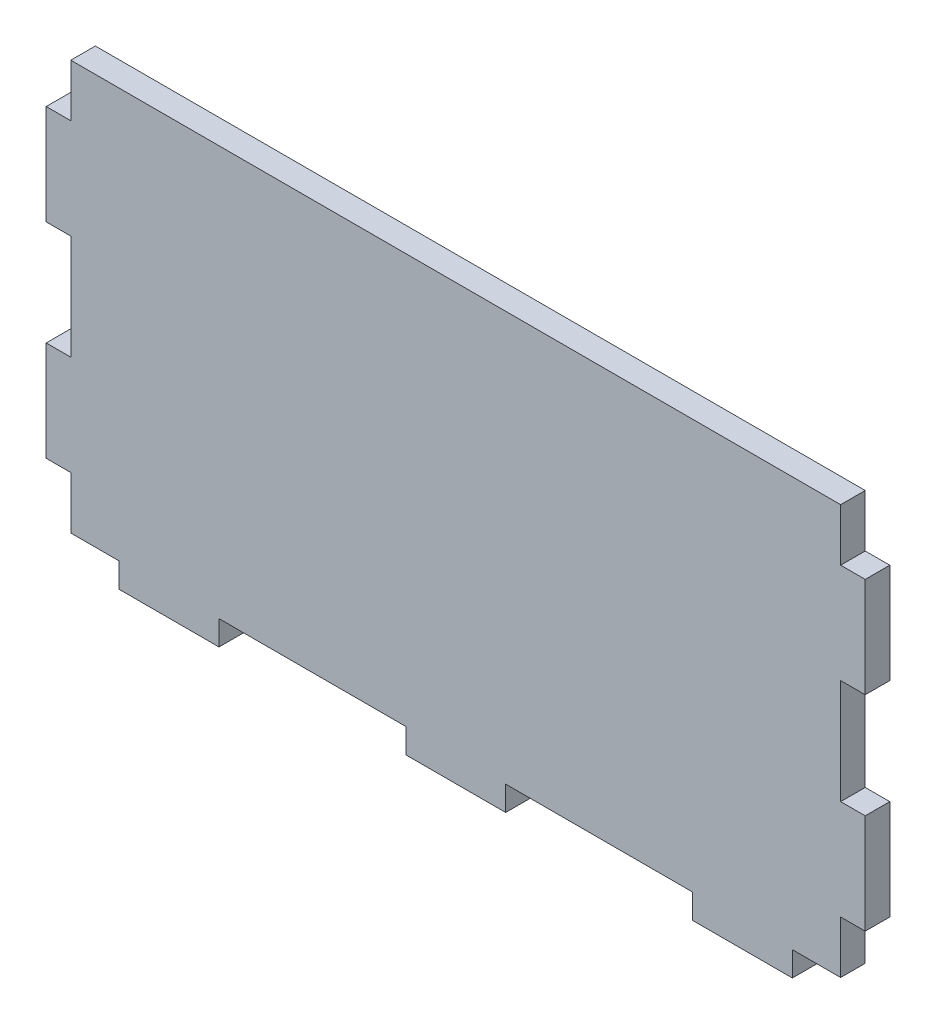
ISO-10303-21;
HEADER;
FILE_DESCRIPTION(('STEP AP214'),'2;1');
FILE_NAME('part.step','',(''),(''),'','','');
FILE_SCHEMA(('AUTOMOTIVE_DESIGN { 1 0 10303 214 1 1 1 1 }'));
ENDSEC;
DATA;
#1=APPLICATION_CONTEXT('core data for automotive mechanical design processes');
#2=APPLICATION_PROTOCOL_DEFINITION('international standard','automotive_design',2000,#1);
#3=PRODUCT_CONTEXT('',#1,'mechanical');
#4=PRODUCT('Part','Part','',(#3));
#5=PRODUCT_RELATED_PRODUCT_CATEGORY('part','',(#4));
#6=PRODUCT_DEFINITION_FORMATION('','',#4);
#7=PRODUCT_DEFINITION_CONTEXT('part definition',#1,'design');
#8=PRODUCT_DEFINITION('design','',#6,#7);
#9=PRODUCT_DEFINITION_SHAPE('','',#8);
#10=(LENGTH_UNIT() NAMED_UNIT(*) SI_UNIT(.MILLI.,.METRE.));
#11=(NAMED_UNIT(*) PLANE_ANGLE_UNIT() SI_UNIT($,.RADIAN.));
#12=(NAMED_UNIT(*) SI_UNIT($,.STERADIAN.) SOLID_ANGLE_UNIT());
#13=UNCERTAINTY_MEASURE_WITH_UNIT(LENGTH_MEASURE(1.E-05),#10,'distance_accuracy_value','');
#14=(GEOMETRIC_REPRESENTATION_CONTEXT(3) GLOBAL_UNCERTAINTY_ASSIGNED_CONTEXT((#13)) GLOBAL_UNIT_ASSIGNED_CONTEXT((#10,
#11,#12)) REPRESENTATION_CONTEXT('',''));
#15=CARTESIAN_POINT('',(0.,0.,0.));
#16=DIRECTION('',(0.,0.,1.));
#17=DIRECTION('',(1.,0.,0.));
#18=AXIS2_PLACEMENT_3D('',#15,#16,#17);
#19=CARTESIAN_POINT('',(0.,0.,-3.));
#20=DIRECTION('',(-1.,0.,0.));
#21=DIRECTION('',(0.,0.,1.));
#22=AXIS2_PLACEMENT_3D('',#19,#20,#21);
#23=PLANE('',#22);
#24=DIRECTION('',(0.,-1.,0.));
#25=VECTOR('',#24,1.);
#26=CARTESIAN_POINT('',(0.,0.,0.));
#27=LINE('',#26,#25);
#28=CARTESIAN_POINT('',(0.,6.4,0.));
#29=VERTEX_POINT('',#28);
#30=CARTESIAN_POINT('',(0.,0.,0.));
#31=VERTEX_POINT('',#30);
#32=EDGE_CURVE('E276',#29,#31,#27,.T.);
#33=ORIENTED_EDGE('',*,*,#32,.F.);
#34=DIRECTION('',(0.,0.,1.));
#35=VECTOR('',#34,1.);
#36=CARTESIAN_POINT('',(0.,6.4,-3.));
#37=LINE('',#36,#35);
#38=CARTESIAN_POINT('',(0.,6.4,-3.));
#39=VERTEX_POINT('',#38);
#40=EDGE_CURVE('E11',#39,#29,#37,.T.);
#41=ORIENTED_EDGE('',*,*,#40,.F.);
#42=DIRECTION('',(0.,-1.,0.));
#43=VECTOR('',#42,1.);
#44=CARTESIAN_POINT('',(0.,0.,-3.));
#45=LINE('',#44,#43);
#46=CARTESIAN_POINT('',(0.,0.,-3.));
#47=VERTEX_POINT('',#46);
#48=EDGE_CURVE('E368',#39,#47,#45,.T.);
#49=ORIENTED_EDGE('',*,*,#48,.T.);
#50=DIRECTION('',(0.,0.,1.));
#51=VECTOR('',#50,1.);
#52=CARTESIAN_POINT('',(0.,0.,-3.));
#53=LINE('',#52,#51);
#54=EDGE_CURVE('E38',#47,#31,#53,.T.);
#55=ORIENTED_EDGE('',*,*,#54,.T.);
#56=EDGE_LOOP('',(#33,#41,#49,#55));
#57=FACE_BOUND('',#56,.T.);
#58=ADVANCED_FACE('F35',(#57),#23,.T.);
#59=CARTESIAN_POINT('',(0.,6.4,-3.));
#60=DIRECTION('',(0.,-1.,0.));
#61=DIRECTION('',(1.,0.,0.));
#62=AXIS2_PLACEMENT_3D('',#59,#60,#61);
#63=PLANE('',#62);
#64=DIRECTION('',(1.,0.,0.));
#65=VECTOR('',#64,1.);
#66=CARTESIAN_POINT('',(0.,6.4,0.));
#67=LINE('',#66,#65);
#68=CARTESIAN_POINT('',(-3.,6.39999999999999,0.));
#69=VERTEX_POINT('',#68);
#70=EDGE_CURVE('E366',#69,#29,#67,.T.);
#71=ORIENTED_EDGE('',*,*,#70,.F.);
#72=DIRECTION('',(0.,0.,1.));
#73=VECTOR('',#72,1.);
#74=CARTESIAN_POINT('',(-3.,6.39999999999999,-3.));
#75=LINE('',#74,#73);
#76=CARTESIAN_POINT('',(-3.,6.39999999999999,-3.));
#77=VERTEX_POINT('',#76);
#78=EDGE_CURVE('E44',#77,#69,#75,.T.);
#79=ORIENTED_EDGE('',*,*,#78,.F.);
#80=DIRECTION('',(1.,0.,0.));
#81=VECTOR('',#80,1.);
#82=CARTESIAN_POINT('',(0.,6.4,-3.));
#83=LINE('',#82,#81);
#84=EDGE_CURVE('E266',#77,#39,#83,.T.);
#85=ORIENTED_EDGE('',*,*,#84,.T.);
#86=ORIENTED_EDGE('',*,*,#40,.T.);
#87=EDGE_LOOP('',(#71,#79,#85,#86));
#88=FACE_BOUND('',#87,.T.);
#89=ADVANCED_FACE('F428',(#88),#63,.T.);
#90=CARTESIAN_POINT('',(-3.,6.39999999999999,-3.));
#91=DIRECTION('',(-1.,0.,0.));
#92=DIRECTION('',(0.,0.,1.));
#93=AXIS2_PLACEMENT_3D('',#90,#91,#92);
#94=PLANE('',#93);
#95=DIRECTION('',(0.,-1.,0.));
#96=VECTOR('',#95,1.);
#97=CARTESIAN_POINT('',(-3.,6.39999999999999,0.));
#98=LINE('',#97,#96);
#99=CARTESIAN_POINT('',(-3.,18.6,0.));
#100=VERTEX_POINT('',#99);
#101=EDGE_CURVE('E253',#100,#69,#98,.T.);
#102=ORIENTED_EDGE('',*,*,#101,.F.);
#103=DIRECTION('',(0.,0.,1.));
#104=VECTOR('',#103,1.);
#105=CARTESIAN_POINT('',(-3.,18.6,-3.));
#106=LINE('',#105,#104);
#107=CARTESIAN_POINT('',(-3.,18.6,-3.));
#108=VERTEX_POINT('',#107);
#109=EDGE_CURVE('E248',#108,#100,#106,.T.);
#110=ORIENTED_EDGE('',*,*,#109,.F.);
#111=DIRECTION('',(0.,-1.,0.));
#112=VECTOR('',#111,1.);
#113=CARTESIAN_POINT('',(-3.,6.39999999999999,-3.));
#114=LINE('',#113,#112);
#115=EDGE_CURVE('E251',#108,#77,#114,.T.);
#116=ORIENTED_EDGE('',*,*,#115,.T.);
#117=ORIENTED_EDGE('',*,*,#78,.T.);
#118=EDGE_LOOP('',(#102,#110,#116,#117));
#119=FACE_BOUND('',#118,.T.);
#120=ADVANCED_FACE('F250',(#119),#94,.T.);
#121=CARTESIAN_POINT('',(0.,18.6,-3.));
#122=DIRECTION('',(0.,1.,0.));
#123=DIRECTION('',(0.,0.,1.));
#124=AXIS2_PLACEMENT_3D('',#121,#122,#123);
#125=PLANE('',#124);
#126=DIRECTION('',(-1.,0.,0.));
#127=VECTOR('',#126,1.);
#128=CARTESIAN_POINT('',(0.,18.6,0.));
#129=LINE('',#128,#127);
#130=CARTESIAN_POINT('',(0.,18.6,0.));
#131=VERTEX_POINT('',#130);
#132=EDGE_CURVE('E363',#131,#100,#129,.T.);
#133=ORIENTED_EDGE('',*,*,#132,.F.);
#134=DIRECTION('',(0.,0.,1.));
#135=VECTOR('',#134,1.);
#136=CARTESIAN_POINT('',(0.,18.6,-3.));
#137=LINE('',#136,#135);
#138=CARTESIAN_POINT('',(0.,18.6,-3.));
#139=VERTEX_POINT('',#138);
#140=EDGE_CURVE('E258',#139,#131,#137,.T.);
#141=ORIENTED_EDGE('',*,*,#140,.F.);
#142=DIRECTION('',(-1.,0.,0.));
#143=VECTOR('',#142,1.);
#144=CARTESIAN_POINT('',(0.,18.6,-3.));
#145=LINE('',#144,#143);
#146=EDGE_CURVE('E264',#139,#108,#145,.T.);
#147=ORIENTED_EDGE('',*,*,#146,.T.);
#148=ORIENTED_EDGE('',*,*,#109,.T.);
#149=EDGE_LOOP('',(#133,#141,#147,#148));
#150=FACE_BOUND('',#149,.T.);
#151=ADVANCED_FACE('F268',(#150),#125,.T.);
#152=CARTESIAN_POINT('',(0.,18.6,-3.));
#153=DIRECTION('',(-1.,0.,0.));
#154=DIRECTION('',(0.,0.,1.));
#155=AXIS2_PLACEMENT_3D('',#152,#153,#154);
#156=PLANE('',#155);
#157=DIRECTION('',(0.,-1.,0.));
#158=VECTOR('',#157,1.);
#159=CARTESIAN_POINT('',(0.,18.6,0.));
#160=LINE('',#159,#158);
#161=CARTESIAN_POINT('',(0.,31.4,0.));
#162=VERTEX_POINT('',#161);
#163=EDGE_CURVE('E360',#162,#131,#160,.T.);
#164=ORIENTED_EDGE('',*,*,#163,.F.);
#165=DIRECTION('',(0.,0.,1.));
#166=VECTOR('',#165,1.);
#167=CARTESIAN_POINT('',(0.,31.4,-3.));
#168=LINE('',#167,#166);
#169=CARTESIAN_POINT('',(0.,31.4,-3.));
#170=VERTEX_POINT('',#169);
#171=EDGE_CURVE('E372',#170,#162,#168,.T.);
#172=ORIENTED_EDGE('',*,*,#171,.F.);
#173=DIRECTION('',(0.,-1.,0.));
#174=VECTOR('',#173,1.);
#175=CARTESIAN_POINT('',(0.,18.6,-3.));
#176=LINE('',#175,#174);
#177=EDGE_CURVE('E269',#170,#139,#176,.T.);
#178=ORIENTED_EDGE('',*,*,#177,.T.);
#179=ORIENTED_EDGE('',*,*,#140,.T.);
#180=EDGE_LOOP('',(#164,#172,#178,#179));
#181=FACE_BOUND('',#180,.T.);
#182=ADVANCED_FACE('F441',(#181),#156,.T.);
#183=CARTESIAN_POINT('',(0.,31.4,-3.));
#184=DIRECTION('',(0.,-1.,0.));
#185=DIRECTION('',(0.,0.,-1.));
#186=AXIS2_PLACEMENT_3D('',#183,#184,#185);
#187=PLANE('',#186);
#188=DIRECTION('',(1.,0.,0.));
#189=VECTOR('',#188,1.);
#190=CARTESIAN_POINT('',(0.,31.4,0.));
#191=LINE('',#190,#189);
#192=CARTESIAN_POINT('',(-3.,31.4,0.));
#193=VERTEX_POINT('',#192);
#194=EDGE_CURVE('E357',#193,#162,#191,.T.);
#195=ORIENTED_EDGE('',*,*,#194,.F.);
#196=DIRECTION('',(0.,0.,1.));
#197=VECTOR('',#196,1.);
#198=CARTESIAN_POINT('',(-3.,31.4,-3.));
#199=LINE('',#198,#197);
#200=CARTESIAN_POINT('',(-3.,31.4,-3.));
#201=VERTEX_POINT('',#200);
#202=EDGE_CURVE('E374',#201,#193,#199,.T.);
#203=ORIENTED_EDGE('',*,*,#202,.F.);
#204=DIRECTION('',(1.,0.,0.));
#205=VECTOR('',#204,1.);
#206=CARTESIAN_POINT('',(0.,31.4,-3.));
#207=LINE('',#206,#205);
#208=EDGE_CURVE('E271',#201,#170,#207,.T.);
#209=ORIENTED_EDGE('',*,*,#208,.T.);
#210=ORIENTED_EDGE('',*,*,#171,.T.);
#211=EDGE_LOOP('',(#195,#203,#209,#210));
#212=FACE_BOUND('',#211,.T.);
#213=ADVANCED_FACE('F444',(#212),#187,.T.);
#214=CARTESIAN_POINT('',(-3.,43.6,-3.));
#215=DIRECTION('',(-1.,0.,0.));
#216=DIRECTION('',(0.,0.,1.));
#217=AXIS2_PLACEMENT_3D('',#214,#215,#216);
#218=PLANE('',#217);
#219=DIRECTION('',(0.,-1.,0.));
#220=VECTOR('',#219,1.);
#221=CARTESIAN_POINT('',(-3.,43.6,0.));
#222=LINE('',#221,#220);
#223=CARTESIAN_POINT('',(-3.,43.6,0.));
#224=VERTEX_POINT('',#223);
#225=EDGE_CURVE('E354',#224,#193,#222,.T.);
#226=ORIENTED_EDGE('',*,*,#225,.F.);
#227=DIRECTION('',(0.,0.,1.));
#228=VECTOR('',#227,1.);
#229=CARTESIAN_POINT('',(-3.,43.6,-3.));
#230=LINE('',#229,#228);
#231=CARTESIAN_POINT('',(-3.,43.6,-3.));
#232=VERTEX_POINT('',#231);
#233=EDGE_CURVE('E376',#232,#224,#230,.T.);
#234=ORIENTED_EDGE('',*,*,#233,.F.);
#235=DIRECTION('',(0.,-1.,0.));
#236=VECTOR('',#235,1.);
#237=CARTESIAN_POINT('',(-3.,43.6,-3.));
#238=LINE('',#237,#236);
#239=EDGE_CURVE('E847',#232,#201,#238,.T.);
#240=ORIENTED_EDGE('',*,*,#239,.T.);
#241=ORIENTED_EDGE('',*,*,#202,.T.);
#242=EDGE_LOOP('',(#226,#234,#240,#241));
#243=FACE_BOUND('',#242,.T.);
#244=ADVANCED_FACE('F448',(#243),#218,.T.);
#245=CARTESIAN_POINT('',(0.,43.6,-3.));
#246=DIRECTION('',(0.,1.,0.));
#247=DIRECTION('',(-1.,0.,0.));
#248=AXIS2_PLACEMENT_3D('',#245,#246,#247);
#249=PLANE('',#248);
#250=DIRECTION('',(-1.,0.,0.));
#251=VECTOR('',#250,1.);
#252=CARTESIAN_POINT('',(0.,43.6,0.));
#253=LINE('',#252,#251);
#254=CARTESIAN_POINT('',(0.,43.6,0.));
#255=VERTEX_POINT('',#254);
#256=EDGE_CURVE('E351',#255,#224,#253,.T.);
#257=ORIENTED_EDGE('',*,*,#256,.F.);
#258=DIRECTION('',(0.,0.,1.));
#259=VECTOR('',#258,1.);
#260=CARTESIAN_POINT('',(0.,43.6,-3.));
#261=LINE('',#260,#259);
#262=CARTESIAN_POINT('',(0.,43.6,-3.));
#263=VERTEX_POINT('',#262);
#264=EDGE_CURVE('E378',#263,#255,#261,.T.);
#265=ORIENTED_EDGE('',*,*,#264,.F.);
#266=DIRECTION('',(-1.,0.,0.));
#267=VECTOR('',#266,1.);
#268=CARTESIAN_POINT('',(0.,43.6,-3.));
#269=LINE('',#268,#267);
#270=EDGE_CURVE('E840',#263,#232,#269,.T.);
#271=ORIENTED_EDGE('',*,*,#270,.T.);
#272=ORIENTED_EDGE('',*,*,#233,.T.);
#273=EDGE_LOOP('',(#257,#265,#271,#272));
#274=FACE_BOUND('',#273,.T.);
#275=ADVANCED_FACE('F452',(#274),#249,.T.);
#276=CARTESIAN_POINT('',(0.,43.6,-3.));
#277=DIRECTION('',(-1.,0.,0.));
#278=DIRECTION('',(0.,0.,1.));
#279=AXIS2_PLACEMENT_3D('',#276,#277,#278);
#280=PLANE('',#279);
#281=DIRECTION('',(0.,-1.,0.));
#282=VECTOR('',#281,1.);
#283=CARTESIAN_POINT('',(0.,43.6,0.));
#284=LINE('',#283,#282);
#285=CARTESIAN_POINT('',(0.,50.,0.));
#286=VERTEX_POINT('',#285);
#287=EDGE_CURVE('E348',#286,#255,#284,.T.);
#288=ORIENTED_EDGE('',*,*,#287,.F.);
#289=DIRECTION('',(0.,0.,1.));
#290=VECTOR('',#289,1.);
#291=CARTESIAN_POINT('',(0.,50.,-3.));
#292=LINE('',#291,#290);
#293=CARTESIAN_POINT('',(0.,50.,-3.));
#294=VERTEX_POINT('',#293);
#295=EDGE_CURVE('E380',#294,#286,#292,.T.);
#296=ORIENTED_EDGE('',*,*,#295,.F.);
#297=DIRECTION('',(0.,-1.,0.));
#298=VECTOR('',#297,1.);
#299=CARTESIAN_POINT('',(0.,43.6,-3.));
#300=LINE('',#299,#298);
#301=EDGE_CURVE('E836',#294,#263,#300,.T.);
#302=ORIENTED_EDGE('',*,*,#301,.T.);
#303=ORIENTED_EDGE('',*,*,#264,.T.);
#304=EDGE_LOOP('',(#288,#296,#302,#303));
#305=FACE_BOUND('',#304,.T.);
#306=ADVANCED_FACE('F456',(#305),#280,.T.);
#307=CARTESIAN_POINT('',(0.,50.,-3.));
#308=DIRECTION('',(0.,1.,0.));
#309=DIRECTION('',(0.,0.,1.));
#310=AXIS2_PLACEMENT_3D('',#307,#308,#309);
#311=PLANE('',#310);
#312=DIRECTION('',(-1.,0.,0.));
#313=VECTOR('',#312,1.);
#314=CARTESIAN_POINT('',(0.,50.,0.));
#315=LINE('',#314,#313);
#316=CARTESIAN_POINT('',(94.,50.,0.));
#317=VERTEX_POINT('',#316);
#318=EDGE_CURVE('E345',#317,#286,#315,.T.);
#319=ORIENTED_EDGE('',*,*,#318,.F.);
#320=DIRECTION('',(0.,0.,1.));
#321=VECTOR('',#320,1.);
#322=CARTESIAN_POINT('',(94.,50.,-3.));
#323=LINE('',#322,#321);
#324=CARTESIAN_POINT('',(94.,50.,-3.));
#325=VERTEX_POINT('',#324);
#326=EDGE_CURVE('E382',#325,#317,#323,.T.);
#327=ORIENTED_EDGE('',*,*,#326,.F.);
#328=DIRECTION('',(-1.,0.,0.));
#329=VECTOR('',#328,1.);
#330=CARTESIAN_POINT('',(0.,50.,-3.));
#331=LINE('',#330,#329);
#332=EDGE_CURVE('E852',#325,#294,#331,.T.);
#333=ORIENTED_EDGE('',*,*,#332,.T.);
#334=ORIENTED_EDGE('',*,*,#295,.T.);
#335=EDGE_LOOP('',(#319,#327,#333,#334));
#336=FACE_BOUND('',#335,.T.);
#337=ADVANCED_FACE('F460',(#336),#311,.T.);
#338=CARTESIAN_POINT('',(94.,43.6,-3.));
#339=DIRECTION('',(1.,0.,0.));
#340=DIRECTION('',(0.,0.,-1.));
#341=AXIS2_PLACEMENT_3D('',#338,#339,#340);
#342=PLANE('',#341);
#343=DIRECTION('',(0.,1.,0.));
#344=VECTOR('',#343,1.);
#345=CARTESIAN_POINT('',(94.,43.6,0.));
#346=LINE('',#345,#344);
#347=CARTESIAN_POINT('',(94.,43.6,0.));
#348=VERTEX_POINT('',#347);
#349=EDGE_CURVE('E342',#348,#317,#346,.T.);
#350=ORIENTED_EDGE('',*,*,#349,.F.);
#351=DIRECTION('',(0.,0.,1.));
#352=VECTOR('',#351,1.);
#353=CARTESIAN_POINT('',(94.,43.6,-3.));
#354=LINE('',#353,#352);
#355=CARTESIAN_POINT('',(94.,43.6,-3.));
#356=VERTEX_POINT('',#355);
#357=EDGE_CURVE('E384',#356,#348,#354,.T.);
#358=ORIENTED_EDGE('',*,*,#357,.F.);
#359=DIRECTION('',(0.,1.,0.));
#360=VECTOR('',#359,1.);
#361=CARTESIAN_POINT('',(94.,43.6,-3.));
#362=LINE('',#361,#360);
#363=EDGE_CURVE('E829',#356,#325,#362,.T.);
#364=ORIENTED_EDGE('',*,*,#363,.T.);
#365=ORIENTED_EDGE('',*,*,#326,.T.);
#366=EDGE_LOOP('',(#350,#358,#364,#365));
#367=FACE_BOUND('',#366,.T.);
#368=ADVANCED_FACE('F464',(#367),#342,.T.);
#369=CARTESIAN_POINT('',(94.,43.6,-3.));
#370=DIRECTION('',(0.,1.,0.));
#371=DIRECTION('',(-1.,0.,0.));
#372=AXIS2_PLACEMENT_3D('',#369,#370,#371);
#373=PLANE('',#372);
#374=DIRECTION('',(-1.,0.,0.));
#375=VECTOR('',#374,1.);
#376=CARTESIAN_POINT('',(94.,43.6,0.));
#377=LINE('',#376,#375);
#378=CARTESIAN_POINT('',(97.,43.6,0.));
#379=VERTEX_POINT('',#378);
#380=EDGE_CURVE('E339',#379,#348,#377,.T.);
#381=ORIENTED_EDGE('',*,*,#380,.F.);
#382=DIRECTION('',(0.,0.,1.));
#383=VECTOR('',#382,1.);
#384=CARTESIAN_POINT('',(97.,43.6,-3.));
#385=LINE('',#384,#383);
#386=CARTESIAN_POINT('',(97.,43.6,-3.));
#387=VERTEX_POINT('',#386);
#388=EDGE_CURVE('E386',#387,#379,#385,.T.);
#389=ORIENTED_EDGE('',*,*,#388,.F.);
#390=DIRECTION('',(-1.,0.,0.));
#391=VECTOR('',#390,1.);
#392=CARTESIAN_POINT('',(94.,43.6,-3.));
#393=LINE('',#392,#391);
#394=EDGE_CURVE('E825',#387,#356,#393,.T.);
#395=ORIENTED_EDGE('',*,*,#394,.T.);
#396=ORIENTED_EDGE('',*,*,#357,.T.);
#397=EDGE_LOOP('',(#381,#389,#395,#396));
#398=FACE_BOUND('',#397,.T.);
#399=ADVANCED_FACE('F468',(#398),#373,.T.);
#400=CARTESIAN_POINT('',(97.,43.6,-3.));
#401=DIRECTION('',(1.,0.,0.));
#402=DIRECTION('',(0.,0.,-1.));
#403=AXIS2_PLACEMENT_3D('',#400,#401,#402);
#404=PLANE('',#403);
#405=DIRECTION('',(0.,1.,0.));
#406=VECTOR('',#405,1.);
#407=CARTESIAN_POINT('',(97.,43.6,0.));
#408=LINE('',#407,#406);
#409=CARTESIAN_POINT('',(97.,31.4,0.));
#410=VERTEX_POINT('',#409);
#411=EDGE_CURVE('E336',#410,#379,#408,.T.);
#412=ORIENTED_EDGE('',*,*,#411,.F.);
#413=DIRECTION('',(0.,0.,1.));
#414=VECTOR('',#413,1.);
#415=CARTESIAN_POINT('',(97.,31.4,-3.));
#416=LINE('',#415,#414);
#417=CARTESIAN_POINT('',(97.,31.4,-3.));
#418=VERTEX_POINT('',#417);
#419=EDGE_CURVE('E388',#418,#410,#416,.T.);
#420=ORIENTED_EDGE('',*,*,#419,.F.);
#421=DIRECTION('',(0.,1.,0.));
#422=VECTOR('',#421,1.);
#423=CARTESIAN_POINT('',(97.,43.6,-3.));
#424=LINE('',#423,#422);
#425=EDGE_CURVE('E856',#418,#387,#424,.T.);
#426=ORIENTED_EDGE('',*,*,#425,.T.);
#427=ORIENTED_EDGE('',*,*,#388,.T.);
#428=EDGE_LOOP('',(#412,#420,#426,#427));
#429=FACE_BOUND('',#428,.T.);
#430=ADVANCED_FACE('F472',(#429),#404,.T.);
#431=CARTESIAN_POINT('',(94.,31.4,-3.));
#432=DIRECTION('',(0.,-1.,0.));
#433=DIRECTION('',(1.,0.,0.));
#434=AXIS2_PLACEMENT_3D('',#431,#432,#433);
#435=PLANE('',#434);
#436=DIRECTION('',(1.,0.,0.));
#437=VECTOR('',#436,1.);
#438=CARTESIAN_POINT('',(94.,31.4,0.));
#439=LINE('',#438,#437);
#440=CARTESIAN_POINT('',(94.,31.4,0.));
#441=VERTEX_POINT('',#440);
#442=EDGE_CURVE('E333',#441,#410,#439,.T.);
#443=ORIENTED_EDGE('',*,*,#442,.F.);
#444=DIRECTION('',(0.,0.,1.));
#445=VECTOR('',#444,1.);
#446=CARTESIAN_POINT('',(94.,31.4,-3.));
#447=LINE('',#446,#445);
#448=CARTESIAN_POINT('',(94.,31.4,-3.));
#449=VERTEX_POINT('',#448);
#450=EDGE_CURVE('E390',#449,#441,#447,.T.);
#451=ORIENTED_EDGE('',*,*,#450,.F.);
#452=DIRECTION('',(1.,0.,0.));
#453=VECTOR('',#452,1.);
#454=CARTESIAN_POINT('',(94.,31.4,-3.));
#455=LINE('',#454,#453);
#456=EDGE_CURVE('E818',#449,#418,#455,.T.);
#457=ORIENTED_EDGE('',*,*,#456,.T.);
#458=ORIENTED_EDGE('',*,*,#419,.T.);
#459=EDGE_LOOP('',(#443,#451,#457,#458));
#460=FACE_BOUND('',#459,.T.);
#461=ADVANCED_FACE('F476',(#460),#435,.T.);
#462=CARTESIAN_POINT('',(94.,18.6,-3.));
#463=DIRECTION('',(1.,0.,0.));
#464=DIRECTION('',(0.,0.,-1.));
#465=AXIS2_PLACEMENT_3D('',#462,#463,#464);
#466=PLANE('',#465);
#467=DIRECTION('',(0.,1.,0.));
#468=VECTOR('',#467,1.);
#469=CARTESIAN_POINT('',(94.,18.6,0.));
#470=LINE('',#469,#468);
#471=CARTESIAN_POINT('',(94.,18.6,0.));
#472=VERTEX_POINT('',#471);
#473=EDGE_CURVE('E330',#472,#441,#470,.T.);
#474=ORIENTED_EDGE('',*,*,#473,.F.);
#475=DIRECTION('',(0.,0.,1.));
#476=VECTOR('',#475,1.);
#477=CARTESIAN_POINT('',(94.,18.6,-3.));
#478=LINE('',#477,#476);
#479=CARTESIAN_POINT('',(94.,18.6,-3.));
#480=VERTEX_POINT('',#479);
#481=EDGE_CURVE('E392',#480,#472,#478,.T.);
#482=ORIENTED_EDGE('',*,*,#481,.F.);
#483=DIRECTION('',(0.,1.,0.));
#484=VECTOR('',#483,1.);
#485=CARTESIAN_POINT('',(94.,18.6,-3.));
#486=LINE('',#485,#484);
#487=EDGE_CURVE('E814',#480,#449,#486,.T.);
#488=ORIENTED_EDGE('',*,*,#487,.T.);
#489=ORIENTED_EDGE('',*,*,#450,.T.);
#490=EDGE_LOOP('',(#474,#482,#488,#489));
#491=FACE_BOUND('',#490,.T.);
#492=ADVANCED_FACE('F480',(#491),#466,.T.);
#493=CARTESIAN_POINT('',(94.,18.6,-3.));
#494=DIRECTION('',(0.,1.,0.));
#495=DIRECTION('',(-1.,0.,0.));
#496=AXIS2_PLACEMENT_3D('',#493,#494,#495);
#497=PLANE('',#496);
#498=DIRECTION('',(-1.,0.,0.));
#499=VECTOR('',#498,1.);
#500=CARTESIAN_POINT('',(94.,18.6,0.));
#501=LINE('',#500,#499);
#502=CARTESIAN_POINT('',(97.,18.6,0.));
#503=VERTEX_POINT('',#502);
#504=EDGE_CURVE('E327',#503,#472,#501,.T.);
#505=ORIENTED_EDGE('',*,*,#504,.F.);
#506=DIRECTION('',(0.,0.,1.));
#507=VECTOR('',#506,1.);
#508=CARTESIAN_POINT('',(97.,18.6,-3.));
#509=LINE('',#508,#507);
#510=CARTESIAN_POINT('',(97.,18.6,-3.));
#511=VERTEX_POINT('',#510);
#512=EDGE_CURVE('E394',#511,#503,#509,.T.);
#513=ORIENTED_EDGE('',*,*,#512,.F.);
#514=DIRECTION('',(-1.,0.,0.));
#515=VECTOR('',#514,1.);
#516=CARTESIAN_POINT('',(94.,18.6,-3.));
#517=LINE('',#516,#515);
#518=EDGE_CURVE('E860',#511,#480,#517,.T.);
#519=ORIENTED_EDGE('',*,*,#518,.T.);
#520=ORIENTED_EDGE('',*,*,#481,.T.);
#521=EDGE_LOOP('',(#505,#513,#519,#520));
#522=FACE_BOUND('',#521,.T.);
#523=ADVANCED_FACE('F484',(#522),#497,.T.);
#524=CARTESIAN_POINT('',(97.,6.39999999999999,-3.));
#525=DIRECTION('',(1.,0.,0.));
#526=DIRECTION('',(0.,0.,-1.));
#527=AXIS2_PLACEMENT_3D('',#524,#525,#526);
#528=PLANE('',#527);
#529=DIRECTION('',(0.,1.,0.));
#530=VECTOR('',#529,1.);
#531=CARTESIAN_POINT('',(97.,6.39999999999999,0.));
#532=LINE('',#531,#530);
#533=CARTESIAN_POINT('',(97.,6.39999999999999,0.));
#534=VERTEX_POINT('',#533);
#535=EDGE_CURVE('E324',#534,#503,#532,.T.);
#536=ORIENTED_EDGE('',*,*,#535,.F.);
#537=DIRECTION('',(0.,0.,1.));
#538=VECTOR('',#537,1.);
#539=CARTESIAN_POINT('',(97.,6.39999999999999,-3.));
#540=LINE('',#539,#538);
#541=CARTESIAN_POINT('',(97.,6.39999999999999,-3.));
#542=VERTEX_POINT('',#541);
#543=EDGE_CURVE('E396',#542,#534,#540,.T.);
#544=ORIENTED_EDGE('',*,*,#543,.F.);
#545=DIRECTION('',(0.,1.,0.));
#546=VECTOR('',#545,1.);
#547=CARTESIAN_POINT('',(97.,6.39999999999999,-3.));
#548=LINE('',#547,#546);
#549=EDGE_CURVE('E807',#542,#511,#548,.T.);
#550=ORIENTED_EDGE('',*,*,#549,.T.);
#551=ORIENTED_EDGE('',*,*,#512,.T.);
#552=EDGE_LOOP('',(#536,#544,#550,#551));
#553=FACE_BOUND('',#552,.T.);
#554=ADVANCED_FACE('F488',(#553),#528,.T.);
#555=CARTESIAN_POINT('',(94.,6.4,-3.));
#556=DIRECTION('',(0.,-1.,0.));
#557=DIRECTION('',(1.,0.,0.));
#558=AXIS2_PLACEMENT_3D('',#555,#556,#557);
#559=PLANE('',#558);
#560=DIRECTION('',(1.,0.,0.));
#561=VECTOR('',#560,1.);
#562=CARTESIAN_POINT('',(94.,6.4,0.));
#563=LINE('',#562,#561);
#564=CARTESIAN_POINT('',(94.,6.4,0.));
#565=VERTEX_POINT('',#564);
#566=EDGE_CURVE('E321',#565,#534,#563,.T.);
#567=ORIENTED_EDGE('',*,*,#566,.F.);
#568=DIRECTION('',(0.,0.,1.));
#569=VECTOR('',#568,1.);
#570=CARTESIAN_POINT('',(94.,6.4,-3.));
#571=LINE('',#570,#569);
#572=CARTESIAN_POINT('',(94.,6.4,-3.));
#573=VERTEX_POINT('',#572);
#574=EDGE_CURVE('E398',#573,#565,#571,.T.);
#575=ORIENTED_EDGE('',*,*,#574,.F.);
#576=DIRECTION('',(1.,0.,0.));
#577=VECTOR('',#576,1.);
#578=CARTESIAN_POINT('',(94.,6.4,-3.));
#579=LINE('',#578,#577);
#580=EDGE_CURVE('E803',#573,#542,#579,.T.);
#581=ORIENTED_EDGE('',*,*,#580,.T.);
#582=ORIENTED_EDGE('',*,*,#543,.T.);
#583=EDGE_LOOP('',(#567,#575,#581,#582));
#584=FACE_BOUND('',#583,.T.);
#585=ADVANCED_FACE('F492',(#584),#559,.T.);
#586=CARTESIAN_POINT('',(94.,0.,-3.));
#587=DIRECTION('',(1.,0.,0.));
#588=DIRECTION('',(0.,0.,-1.));
#589=AXIS2_PLACEMENT_3D('',#586,#587,#588);
#590=PLANE('',#589);
#591=DIRECTION('',(0.,1.,0.));
#592=VECTOR('',#591,1.);
#593=CARTESIAN_POINT('',(94.,0.,0.));
#594=LINE('',#593,#592);
#595=CARTESIAN_POINT('',(94.,0.,0.));
#596=VERTEX_POINT('',#595);
#597=EDGE_CURVE('E318',#596,#565,#594,.T.);
#598=ORIENTED_EDGE('',*,*,#597,.F.);
#599=DIRECTION('',(0.,0.,1.));
#600=VECTOR('',#599,1.);
#601=CARTESIAN_POINT('',(94.,0.,-3.));
#602=LINE('',#601,#600);
#603=CARTESIAN_POINT('',(94.,0.,-3.));
#604=VERTEX_POINT('',#603);
#605=EDGE_CURVE('E400',#604,#596,#602,.T.);
#606=ORIENTED_EDGE('',*,*,#605,.F.);
#607=DIRECTION('',(0.,1.,0.));
#608=VECTOR('',#607,1.);
#609=CARTESIAN_POINT('',(94.,0.,-3.));
#610=LINE('',#609,#608);
#611=EDGE_CURVE('E864',#604,#573,#610,.T.);
#612=ORIENTED_EDGE('',*,*,#611,.T.);
#613=ORIENTED_EDGE('',*,*,#574,.T.);
#614=EDGE_LOOP('',(#598,#606,#612,#613));
#615=FACE_BOUND('',#614,.T.);
#616=ADVANCED_FACE('F496',(#615),#590,.T.);
#617=CARTESIAN_POINT('',(88.1,0.,-3.));
#618=DIRECTION('',(0.,-1.,0.));
#619=DIRECTION('',(1.,0.,0.));
#620=AXIS2_PLACEMENT_3D('',#617,#618,#619);
#621=PLANE('',#620);
#622=DIRECTION('',(1.,0.,0.));
#623=VECTOR('',#622,1.);
#624=CARTESIAN_POINT('',(88.1,0.,0.));
#625=LINE('',#624,#623);
#626=CARTESIAN_POINT('',(88.1,0.,0.));
#627=VERTEX_POINT('',#626);
#628=EDGE_CURVE('E315',#627,#596,#625,.T.);
#629=ORIENTED_EDGE('',*,*,#628,.F.);
#630=DIRECTION('',(0.,0.,1.));
#631=VECTOR('',#630,1.);
#632=CARTESIAN_POINT('',(88.1,0.,-3.));
#633=LINE('',#632,#631);
#634=CARTESIAN_POINT('',(88.1,0.,-3.));
#635=VERTEX_POINT('',#634);
#636=EDGE_CURVE('E402',#635,#627,#633,.T.);
#637=ORIENTED_EDGE('',*,*,#636,.F.);
#638=DIRECTION('',(1.,0.,0.));
#639=VECTOR('',#638,1.);
#640=CARTESIAN_POINT('',(88.1,0.,-3.));
#641=LINE('',#640,#639);
#642=EDGE_CURVE('E796',#635,#604,#641,.T.);
#643=ORIENTED_EDGE('',*,*,#642,.T.);
#644=ORIENTED_EDGE('',*,*,#605,.T.);
#645=EDGE_LOOP('',(#629,#637,#643,#644));
#646=FACE_BOUND('',#645,.T.);
#647=ADVANCED_FACE('F500',(#646),#621,.T.);
#648=CARTESIAN_POINT('',(88.1,0.,-3.));
#649=DIRECTION('',(1.,0.,0.));
#650=DIRECTION('',(0.,0.,-1.));
#651=AXIS2_PLACEMENT_3D('',#648,#649,#650);
#652=PLANE('',#651);
#653=DIRECTION('',(0.,1.,0.));
#654=VECTOR('',#653,1.);
#655=CARTESIAN_POINT('',(88.1,0.,0.));
#656=LINE('',#655,#654);
#657=CARTESIAN_POINT('',(88.1,-3.,0.));
#658=VERTEX_POINT('',#657);
#659=EDGE_CURVE('E312',#658,#627,#656,.T.);
#660=ORIENTED_EDGE('',*,*,#659,.F.);
#661=DIRECTION('',(0.,0.,1.));
#662=VECTOR('',#661,1.);
#663=CARTESIAN_POINT('',(88.1,-3.,-3.));
#664=LINE('',#663,#662);
#665=CARTESIAN_POINT('',(88.1,-3.,-3.));
#666=VERTEX_POINT('',#665);
#667=EDGE_CURVE('E404',#666,#658,#664,.T.);
#668=ORIENTED_EDGE('',*,*,#667,.F.);
#669=DIRECTION('',(0.,1.,0.));
#670=VECTOR('',#669,1.);
#671=CARTESIAN_POINT('',(88.1,0.,-3.));
#672=LINE('',#671,#670);
#673=EDGE_CURVE('E792',#666,#635,#672,.T.);
#674=ORIENTED_EDGE('',*,*,#673,.T.);
#675=ORIENTED_EDGE('',*,*,#636,.T.);
#676=EDGE_LOOP('',(#660,#668,#674,#675));
#677=FACE_BOUND('',#676,.T.);
#678=ADVANCED_FACE('F504',(#677),#652,.T.);
#679=CARTESIAN_POINT('',(75.9,-3.,-3.));
#680=DIRECTION('',(0.,-1.,0.));
#681=DIRECTION('',(1.,0.,0.));
#682=AXIS2_PLACEMENT_3D('',#679,#680,#681);
#683=PLANE('',#682);
#684=DIRECTION('',(1.,0.,0.));
#685=VECTOR('',#684,1.);
#686=CARTESIAN_POINT('',(75.9,-3.,0.));
#687=LINE('',#686,#685);
#688=CARTESIAN_POINT('',(75.9,-3.,0.));
#689=VERTEX_POINT('',#688);
#690=EDGE_CURVE('E309',#689,#658,#687,.T.);
#691=ORIENTED_EDGE('',*,*,#690,.F.);
#692=DIRECTION('',(0.,0.,1.));
#693=VECTOR('',#692,1.);
#694=CARTESIAN_POINT('',(75.9,-3.,-3.));
#695=LINE('',#694,#693);
#696=CARTESIAN_POINT('',(75.9,-3.,-3.));
#697=VERTEX_POINT('',#696);
#698=EDGE_CURVE('E406',#697,#689,#695,.T.);
#699=ORIENTED_EDGE('',*,*,#698,.F.);
#700=DIRECTION('',(1.,0.,0.));
#701=VECTOR('',#700,1.);
#702=CARTESIAN_POINT('',(75.9,-3.,-3.));
#703=LINE('',#702,#701);
#704=EDGE_CURVE('E868',#697,#666,#703,.T.);
#705=ORIENTED_EDGE('',*,*,#704,.T.);
#706=ORIENTED_EDGE('',*,*,#667,.T.);
#707=EDGE_LOOP('',(#691,#699,#705,#706));
#708=FACE_BOUND('',#707,.T.);
#709=ADVANCED_FACE('F508',(#708),#683,.T.);
#710=CARTESIAN_POINT('',(75.9,0.,-3.));
#711=DIRECTION('',(-1.,0.,0.));
#712=DIRECTION('',(0.,0.,1.));
#713=AXIS2_PLACEMENT_3D('',#710,#711,#712);
#714=PLANE('',#713);
#715=DIRECTION('',(0.,-1.,0.));
#716=VECTOR('',#715,1.);
#717=CARTESIAN_POINT('',(75.9,0.,0.));
#718=LINE('',#717,#716);
#719=CARTESIAN_POINT('',(75.9,0.,0.));
#720=VERTEX_POINT('',#719);
#721=EDGE_CURVE('E306',#720,#689,#718,.T.);
#722=ORIENTED_EDGE('',*,*,#721,.F.);
#723=DIRECTION('',(0.,0.,1.));
#724=VECTOR('',#723,1.);
#725=CARTESIAN_POINT('',(75.9,0.,-3.));
#726=LINE('',#725,#724);
#727=CARTESIAN_POINT('',(75.9,0.,-3.));
#728=VERTEX_POINT('',#727);
#729=EDGE_CURVE('E408',#728,#720,#726,.T.);
#730=ORIENTED_EDGE('',*,*,#729,.F.);
#731=DIRECTION('',(0.,-1.,0.));
#732=VECTOR('',#731,1.);
#733=CARTESIAN_POINT('',(75.9,0.,-3.));
#734=LINE('',#733,#732);
#735=EDGE_CURVE('E785',#728,#697,#734,.T.);
#736=ORIENTED_EDGE('',*,*,#735,.T.);
#737=ORIENTED_EDGE('',*,*,#698,.T.);
#738=EDGE_LOOP('',(#722,#730,#736,#737));
#739=FACE_BOUND('',#738,.T.);
#740=ADVANCED_FACE('F512',(#739),#714,.T.);
#741=CARTESIAN_POINT('',(53.1,0.,-3.));
#742=DIRECTION('',(0.,-1.,0.));
#743=DIRECTION('',(1.,0.,0.));
#744=AXIS2_PLACEMENT_3D('',#741,#742,#743);
#745=PLANE('',#744);
#746=DIRECTION('',(1.,0.,0.));
#747=VECTOR('',#746,1.);
#748=CARTESIAN_POINT('',(53.1,0.,0.));
#749=LINE('',#748,#747);
#750=CARTESIAN_POINT('',(53.1,0.,0.));
#751=VERTEX_POINT('',#750);
#752=EDGE_CURVE('E303',#751,#720,#749,.T.);
#753=ORIENTED_EDGE('',*,*,#752,.F.);
#754=DIRECTION('',(0.,0.,1.));
#755=VECTOR('',#754,1.);
#756=CARTESIAN_POINT('',(53.1,0.,-3.));
#757=LINE('',#756,#755);
#758=CARTESIAN_POINT('',(53.1,0.,-3.));
#759=VERTEX_POINT('',#758);
#760=EDGE_CURVE('E410',#759,#751,#757,.T.);
#761=ORIENTED_EDGE('',*,*,#760,.F.);
#762=DIRECTION('',(1.,0.,0.));
#763=VECTOR('',#762,1.);
#764=CARTESIAN_POINT('',(53.1,0.,-3.));
#765=LINE('',#764,#763);
#766=EDGE_CURVE('E781',#759,#728,#765,.T.);
#767=ORIENTED_EDGE('',*,*,#766,.T.);
#768=ORIENTED_EDGE('',*,*,#729,.T.);
#769=EDGE_LOOP('',(#753,#761,#767,#768));
#770=FACE_BOUND('',#769,.T.);
#771=ADVANCED_FACE('F516',(#770),#745,.T.);
#772=CARTESIAN_POINT('',(53.1,0.,-3.));
#773=DIRECTION('',(1.,0.,0.));
#774=DIRECTION('',(0.,0.,-1.));
#775=AXIS2_PLACEMENT_3D('',#772,#773,#774);
#776=PLANE('',#775);
#777=DIRECTION('',(0.,1.,0.));
#778=VECTOR('',#777,1.);
#779=CARTESIAN_POINT('',(53.1,0.,0.));
#780=LINE('',#779,#778);
#781=CARTESIAN_POINT('',(53.1,-3.,0.));
#782=VERTEX_POINT('',#781);
#783=EDGE_CURVE('E300',#782,#751,#780,.T.);
#784=ORIENTED_EDGE('',*,*,#783,.F.);
#785=DIRECTION('',(0.,0.,1.));
#786=VECTOR('',#785,1.);
#787=CARTESIAN_POINT('',(53.1,-3.,-3.));
#788=LINE('',#787,#786);
#789=CARTESIAN_POINT('',(53.1,-3.,-3.));
#790=VERTEX_POINT('',#789);
#791=EDGE_CURVE('E412',#790,#782,#788,.T.);
#792=ORIENTED_EDGE('',*,*,#791,.F.);
#793=DIRECTION('',(0.,1.,0.));
#794=VECTOR('',#793,1.);
#795=CARTESIAN_POINT('',(53.1,0.,-3.));
#796=LINE('',#795,#794);
#797=EDGE_CURVE('E872',#790,#759,#796,.T.);
#798=ORIENTED_EDGE('',*,*,#797,.T.);
#799=ORIENTED_EDGE('',*,*,#760,.T.);
#800=EDGE_LOOP('',(#784,#792,#798,#799));
#801=FACE_BOUND('',#800,.T.);
#802=ADVANCED_FACE('F520',(#801),#776,.T.);
#803=CARTESIAN_POINT('',(40.9,-3.,-3.));
#804=DIRECTION('',(0.,-1.,0.));
#805=DIRECTION('',(1.,0.,0.));
#806=AXIS2_PLACEMENT_3D('',#803,#804,#805);
#807=PLANE('',#806);
#808=DIRECTION('',(1.,0.,0.));
#809=VECTOR('',#808,1.);
#810=CARTESIAN_POINT('',(40.9,-3.,0.));
#811=LINE('',#810,#809);
#812=CARTESIAN_POINT('',(40.9,-3.,0.));
#813=VERTEX_POINT('',#812);
#814=EDGE_CURVE('E297',#813,#782,#811,.T.);
#815=ORIENTED_EDGE('',*,*,#814,.F.);
#816=DIRECTION('',(0.,0.,1.));
#817=VECTOR('',#816,1.);
#818=CARTESIAN_POINT('',(40.9,-3.,-3.));
#819=LINE('',#818,#817);
#820=CARTESIAN_POINT('',(40.9,-3.,-3.));
#821=VERTEX_POINT('',#820);
#822=EDGE_CURVE('E414',#821,#813,#819,.T.);
#823=ORIENTED_EDGE('',*,*,#822,.F.);
#824=DIRECTION('',(1.,0.,0.));
#825=VECTOR('',#824,1.);
#826=CARTESIAN_POINT('',(40.9,-3.,-3.));
#827=LINE('',#826,#825);
#828=EDGE_CURVE('E774',#821,#790,#827,.T.);
#829=ORIENTED_EDGE('',*,*,#828,.T.);
#830=ORIENTED_EDGE('',*,*,#791,.T.);
#831=EDGE_LOOP('',(#815,#823,#829,#830));
#832=FACE_BOUND('',#831,.T.);
#833=ADVANCED_FACE('F524',(#832),#807,.T.);
#834=CARTESIAN_POINT('',(40.9,0.,-3.));
#835=DIRECTION('',(-1.,0.,0.));
#836=DIRECTION('',(0.,0.,1.));
#837=AXIS2_PLACEMENT_3D('',#834,#835,#836);
#838=PLANE('',#837);
#839=DIRECTION('',(0.,-1.,0.));
#840=VECTOR('',#839,1.);
#841=CARTESIAN_POINT('',(40.9,0.,0.));
#842=LINE('',#841,#840);
#843=CARTESIAN_POINT('',(40.9,0.,0.));
#844=VERTEX_POINT('',#843);
#845=EDGE_CURVE('E294',#844,#813,#842,.T.);
#846=ORIENTED_EDGE('',*,*,#845,.F.);
#847=DIRECTION('',(0.,0.,1.));
#848=VECTOR('',#847,1.);
#849=CARTESIAN_POINT('',(40.9,0.,-3.));
#850=LINE('',#849,#848);
#851=CARTESIAN_POINT('',(40.9,0.,-3.));
#852=VERTEX_POINT('',#851);
#853=EDGE_CURVE('E416',#852,#844,#850,.T.);
#854=ORIENTED_EDGE('',*,*,#853,.F.);
#855=DIRECTION('',(0.,-1.,0.));
#856=VECTOR('',#855,1.);
#857=CARTESIAN_POINT('',(40.9,0.,-3.));
#858=LINE('',#857,#856);
#859=EDGE_CURVE('E770',#852,#821,#858,.T.);
#860=ORIENTED_EDGE('',*,*,#859,.T.);
#861=ORIENTED_EDGE('',*,*,#822,.T.);
#862=EDGE_LOOP('',(#846,#854,#860,#861));
#863=FACE_BOUND('',#862,.T.);
#864=ADVANCED_FACE('F528',(#863),#838,.T.);
#865=CARTESIAN_POINT('',(18.1,0.,-3.));
#866=DIRECTION('',(0.,-1.,0.));
#867=DIRECTION('',(1.,0.,0.));
#868=AXIS2_PLACEMENT_3D('',#865,#866,#867);
#869=PLANE('',#868);
#870=DIRECTION('',(1.,0.,0.));
#871=VECTOR('',#870,1.);
#872=CARTESIAN_POINT('',(18.1,0.,0.));
#873=LINE('',#872,#871);
#874=CARTESIAN_POINT('',(18.1,0.,0.));
#875=VERTEX_POINT('',#874);
#876=EDGE_CURVE('E291',#875,#844,#873,.T.);
#877=ORIENTED_EDGE('',*,*,#876,.F.);
#878=DIRECTION('',(0.,0.,1.));
#879=VECTOR('',#878,1.);
#880=CARTESIAN_POINT('',(18.1,0.,-3.));
#881=LINE('',#880,#879);
#882=CARTESIAN_POINT('',(18.1,0.,-3.));
#883=VERTEX_POINT('',#882);
#884=EDGE_CURVE('E418',#883,#875,#881,.T.);
#885=ORIENTED_EDGE('',*,*,#884,.F.);
#886=DIRECTION('',(1.,0.,0.));
#887=VECTOR('',#886,1.);
#888=CARTESIAN_POINT('',(18.1,0.,-3.));
#889=LINE('',#888,#887);
#890=EDGE_CURVE('E876',#883,#852,#889,.T.);
#891=ORIENTED_EDGE('',*,*,#890,.T.);
#892=ORIENTED_EDGE('',*,*,#853,.T.);
#893=EDGE_LOOP('',(#877,#885,#891,#892));
#894=FACE_BOUND('',#893,.T.);
#895=ADVANCED_FACE('F532',(#894),#869,.T.);
#896=CARTESIAN_POINT('',(18.1,0.,-3.));
#897=DIRECTION('',(1.,0.,0.));
#898=DIRECTION('',(0.,0.,-1.));
#899=AXIS2_PLACEMENT_3D('',#896,#897,#898);
#900=PLANE('',#899);
#901=DIRECTION('',(0.,1.,0.));
#902=VECTOR('',#901,1.);
#903=CARTESIAN_POINT('',(18.1,0.,0.));
#904=LINE('',#903,#902);
#905=CARTESIAN_POINT('',(18.1,-3.00000000000001,0.));
#906=VERTEX_POINT('',#905);
#907=EDGE_CURVE('E288',#906,#875,#904,.T.);
#908=ORIENTED_EDGE('',*,*,#907,.F.);
#909=DIRECTION('',(0.,0.,1.));
#910=VECTOR('',#909,1.);
#911=CARTESIAN_POINT('',(18.1,-3.00000000000001,-3.));
#912=LINE('',#911,#910);
#913=CARTESIAN_POINT('',(18.1,-3.00000000000001,-3.));
#914=VERTEX_POINT('',#913);
#915=EDGE_CURVE('E420',#914,#906,#912,.T.);
#916=ORIENTED_EDGE('',*,*,#915,.F.);
#917=DIRECTION('',(0.,1.,0.));
#918=VECTOR('',#917,1.);
#919=CARTESIAN_POINT('',(18.1,0.,-3.));
#920=LINE('',#919,#918);
#921=EDGE_CURVE('E763',#914,#883,#920,.T.);
#922=ORIENTED_EDGE('',*,*,#921,.T.);
#923=ORIENTED_EDGE('',*,*,#884,.T.);
#924=EDGE_LOOP('',(#908,#916,#922,#923));
#925=FACE_BOUND('',#924,.T.);
#926=ADVANCED_FACE('F536',(#925),#900,.T.);
#927=CARTESIAN_POINT('',(18.1,-3.00000000000001,-3.));
#928=DIRECTION('',(0.,-1.,0.));
#929=DIRECTION('',(1.,0.,0.));
#930=AXIS2_PLACEMENT_3D('',#927,#928,#929);
#931=PLANE('',#930);
#932=DIRECTION('',(1.,0.,0.));
#933=VECTOR('',#932,1.);
#934=CARTESIAN_POINT('',(18.1,-3.00000000000001,0.));
#935=LINE('',#934,#933);
#936=CARTESIAN_POINT('',(5.90000000000002,-3.00000000000001,0.));
#937=VERTEX_POINT('',#936);
#938=EDGE_CURVE('E285',#937,#906,#935,.T.);
#939=ORIENTED_EDGE('',*,*,#938,.F.);
#940=DIRECTION('',(0.,0.,1.));
#941=VECTOR('',#940,1.);
#942=CARTESIAN_POINT('',(5.90000000000002,-3.00000000000001,-3.));
#943=LINE('',#942,#941);
#944=CARTESIAN_POINT('',(5.90000000000002,-3.00000000000001,-3.));
#945=VERTEX_POINT('',#944);
#946=EDGE_CURVE('E422',#945,#937,#943,.T.);
#947=ORIENTED_EDGE('',*,*,#946,.F.);
#948=DIRECTION('',(1.,0.,0.));
#949=VECTOR('',#948,1.);
#950=CARTESIAN_POINT('',(18.1,-3.00000000000001,-3.));
#951=LINE('',#950,#949);
#952=EDGE_CURVE('E759',#945,#914,#951,.T.);
#953=ORIENTED_EDGE('',*,*,#952,.T.);
#954=ORIENTED_EDGE('',*,*,#915,.T.);
#955=EDGE_LOOP('',(#939,#947,#953,#954));
#956=FACE_BOUND('',#955,.T.);
#957=ADVANCED_FACE('F540',(#956),#931,.T.);
#958=CARTESIAN_POINT('',(5.90000000000002,0.,-3.));
#959=DIRECTION('',(-1.,0.,0.));
#960=DIRECTION('',(0.,0.,1.));
#961=AXIS2_PLACEMENT_3D('',#958,#959,#960);
#962=PLANE('',#961);
#963=DIRECTION('',(0.,-1.,0.));
#964=VECTOR('',#963,1.);
#965=CARTESIAN_POINT('',(5.90000000000002,0.,0.));
#966=LINE('',#965,#964);
#967=CARTESIAN_POINT('',(5.90000000000002,0.,0.));
#968=VERTEX_POINT('',#967);
#969=EDGE_CURVE('E282',#968,#937,#966,.T.);
#970=ORIENTED_EDGE('',*,*,#969,.F.);
#971=DIRECTION('',(0.,0.,1.));
#972=VECTOR('',#971,1.);
#973=CARTESIAN_POINT('',(5.90000000000002,0.,-3.));
#974=LINE('',#973,#972);
#975=CARTESIAN_POINT('',(5.90000000000002,0.,-3.));
#976=VERTEX_POINT('',#975);
#977=EDGE_CURVE('E423',#976,#968,#974,.T.);
#978=ORIENTED_EDGE('',*,*,#977,.F.);
#979=DIRECTION('',(0.,-1.,0.));
#980=VECTOR('',#979,1.);
#981=CARTESIAN_POINT('',(5.90000000000002,0.,-3.));
#982=LINE('',#981,#980);
#983=EDGE_CURVE('E880',#976,#945,#982,.T.);
#984=ORIENTED_EDGE('',*,*,#983,.T.);
#985=ORIENTED_EDGE('',*,*,#946,.T.);
#986=EDGE_LOOP('',(#970,#978,#984,#985));
#987=FACE_BOUND('',#986,.T.);
#988=ADVANCED_FACE('F544',(#987),#962,.T.);
#989=CARTESIAN_POINT('',(0.,0.,-3.));
#990=DIRECTION('',(0.,-1.,0.));
#991=DIRECTION('',(1.,0.,0.));
#992=AXIS2_PLACEMENT_3D('',#989,#990,#991);
#993=PLANE('',#992);
#994=DIRECTION('',(1.,0.,0.));
#995=VECTOR('',#994,1.);
#996=CARTESIAN_POINT('',(0.,0.,0.));
#997=LINE('',#996,#995);
#998=EDGE_CURVE('E279',#31,#968,#997,.T.);
#999=ORIENTED_EDGE('',*,*,#998,.F.);
#1000=ORIENTED_EDGE('',*,*,#54,.F.);
#1001=DIRECTION('',(1.,0.,0.));
#1002=VECTOR('',#1001,1.);
#1003=CARTESIAN_POINT('',(0.,0.,-3.));
#1004=LINE('',#1003,#1002);
#1005=EDGE_CURVE('E882',#47,#976,#1004,.T.);
#1006=ORIENTED_EDGE('',*,*,#1005,.T.);
#1007=ORIENTED_EDGE('',*,*,#977,.T.);
#1008=EDGE_LOOP('',(#999,#1000,#1006,#1007));
#1009=FACE_BOUND('',#1008,.T.);
#1010=ADVANCED_FACE('F425',(#1009),#993,.T.);
#1011=CARTESIAN_POINT('',(0.,0.,-3.));
#1012=DIRECTION('',(0.,0.,1.));
#1013=DIRECTION('',(1.,0.,0.));
#1014=AXIS2_PLACEMENT_3D('',#1011,#1012,#1013);
#1015=PLANE('',#1014);
#1016=ORIENTED_EDGE('',*,*,#48,.F.);
#1017=ORIENTED_EDGE('',*,*,#84,.F.);
#1018=ORIENTED_EDGE('',*,*,#115,.F.);
#1019=ORIENTED_EDGE('',*,*,#146,.F.);
#1020=ORIENTED_EDGE('',*,*,#177,.F.);
#1021=ORIENTED_EDGE('',*,*,#208,.F.);
#1022=ORIENTED_EDGE('',*,*,#239,.F.);
#1023=ORIENTED_EDGE('',*,*,#270,.F.);
#1024=ORIENTED_EDGE('',*,*,#301,.F.);
#1025=ORIENTED_EDGE('',*,*,#332,.F.);
#1026=ORIENTED_EDGE('',*,*,#363,.F.);
#1027=ORIENTED_EDGE('',*,*,#394,.F.);
#1028=ORIENTED_EDGE('',*,*,#425,.F.);
#1029=ORIENTED_EDGE('',*,*,#456,.F.);
#1030=ORIENTED_EDGE('',*,*,#487,.F.);
#1031=ORIENTED_EDGE('',*,*,#518,.F.);
#1032=ORIENTED_EDGE('',*,*,#549,.F.);
#1033=ORIENTED_EDGE('',*,*,#580,.F.);
#1034=ORIENTED_EDGE('',*,*,#611,.F.);
#1035=ORIENTED_EDGE('',*,*,#642,.F.);
#1036=ORIENTED_EDGE('',*,*,#673,.F.);
#1037=ORIENTED_EDGE('',*,*,#704,.F.);
#1038=ORIENTED_EDGE('',*,*,#735,.F.);
#1039=ORIENTED_EDGE('',*,*,#766,.F.);
#1040=ORIENTED_EDGE('',*,*,#797,.F.);
#1041=ORIENTED_EDGE('',*,*,#828,.F.);
#1042=ORIENTED_EDGE('',*,*,#859,.F.);
#1043=ORIENTED_EDGE('',*,*,#890,.F.);
#1044=ORIENTED_EDGE('',*,*,#921,.F.);
#1045=ORIENTED_EDGE('',*,*,#952,.F.);
#1046=ORIENTED_EDGE('',*,*,#983,.F.);
#1047=ORIENTED_EDGE('',*,*,#1005,.F.);
#1048=EDGE_LOOP('',(#1016,#1017,#1018,#1019,#1020,#1021,#1022,#1023,#1024,#1025,#1026,#1027,
#1028,#1029,#1030,#1031,#1032,#1033,#1034,#1035,#1036,#1037,#1038,#1039,#1040,#1041,#1042,#1043,
#1044,#1045,#1046,#1047));
#1049=FACE_BOUND('',#1048,.T.);
#1050=ADVANCED_FACE('F262',(#1049),#1015,.F.);
#1051=CARTESIAN_POINT('',(0.,0.,0.));
#1052=DIRECTION('',(0.,0.,1.));
#1053=DIRECTION('',(1.,0.,0.));
#1054=AXIS2_PLACEMENT_3D('',#1051,#1052,#1053);
#1055=PLANE('',#1054);
#1056=ORIENTED_EDGE('',*,*,#32,.T.);
#1057=ORIENTED_EDGE('',*,*,#998,.T.);
#1058=ORIENTED_EDGE('',*,*,#969,.T.);
#1059=ORIENTED_EDGE('',*,*,#938,.T.);
#1060=ORIENTED_EDGE('',*,*,#907,.T.);
#1061=ORIENTED_EDGE('',*,*,#876,.T.);
#1062=ORIENTED_EDGE('',*,*,#845,.T.);
#1063=ORIENTED_EDGE('',*,*,#814,.T.);
#1064=ORIENTED_EDGE('',*,*,#783,.T.);
#1065=ORIENTED_EDGE('',*,*,#752,.T.);
#1066=ORIENTED_EDGE('',*,*,#721,.T.);
#1067=ORIENTED_EDGE('',*,*,#690,.T.);
#1068=ORIENTED_EDGE('',*,*,#659,.T.);
#1069=ORIENTED_EDGE('',*,*,#628,.T.);
#1070=ORIENTED_EDGE('',*,*,#597,.T.);
#1071=ORIENTED_EDGE('',*,*,#566,.T.);
#1072=ORIENTED_EDGE('',*,*,#535,.T.);
#1073=ORIENTED_EDGE('',*,*,#504,.T.);
#1074=ORIENTED_EDGE('',*,*,#473,.T.);
#1075=ORIENTED_EDGE('',*,*,#442,.T.);
#1076=ORIENTED_EDGE('',*,*,#411,.T.);
#1077=ORIENTED_EDGE('',*,*,#380,.T.);
#1078=ORIENTED_EDGE('',*,*,#349,.T.);
#1079=ORIENTED_EDGE('',*,*,#318,.T.);
#1080=ORIENTED_EDGE('',*,*,#287,.T.);
#1081=ORIENTED_EDGE('',*,*,#256,.T.);
#1082=ORIENTED_EDGE('',*,*,#225,.T.);
#1083=ORIENTED_EDGE('',*,*,#194,.T.);
#1084=ORIENTED_EDGE('',*,*,#163,.T.);
#1085=ORIENTED_EDGE('',*,*,#132,.T.);
#1086=ORIENTED_EDGE('',*,*,#101,.T.);
#1087=ORIENTED_EDGE('',*,*,#70,.T.);
#1088=EDGE_LOOP('',(#1056,#1057,#1058,#1059,#1060,#1061,#1062,#1063,#1064,#1065,#1066,#1067,
#1068,#1069,#1070,#1071,#1072,#1073,#1074,#1075,#1076,#1077,#1078,#1079,#1080,#1081,#1082,#1083,
#1084,#1085,#1086,#1087));
#1089=FACE_BOUND('',#1088,.T.);
#1090=ADVANCED_FACE('F427',(#1089),#1055,.T.);
#1091=CLOSED_SHELL('',(#58,#89,#120,#151,#182,#213,#244,#275,#306,#337,#368,#399,#430,#461,#492,
#523,#554,#585,#616,#647,#678,#709,#740,#771,#802,#833,#864,#895,#926,#957,#988,#1010,#1050,#1090));
#1092=MANIFOLD_SOLID_BREP('B2',#1091);
#1093=ADVANCED_BREP_SHAPE_REPRESENTATION('',(#18,#1092),#14);
#1094=SHAPE_DEFINITION_REPRESENTATION(#9,#1093);
ENDSEC;
END-ISO-10303-21;
